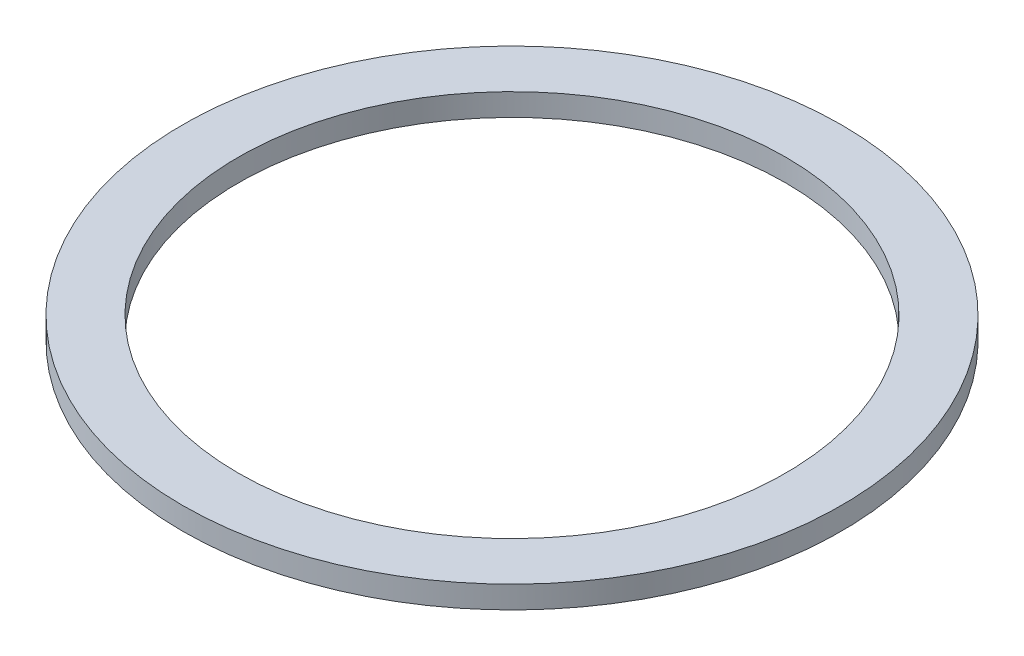
ISO-10303-21;
HEADER;
FILE_DESCRIPTION(('STEP AP214'),'2;1');
FILE_NAME('part.step','',(''),(''),'','','');
FILE_SCHEMA(('AUTOMOTIVE_DESIGN { 1 0 10303 214 1 1 1 1 }'));
ENDSEC;
DATA;
#1=APPLICATION_CONTEXT('core data for automotive mechanical design processes');
#2=APPLICATION_PROTOCOL_DEFINITION('international standard','automotive_design',2000,#1);
#3=PRODUCT_CONTEXT('',#1,'mechanical');
#4=PRODUCT('Part','Part','',(#3));
#5=PRODUCT_RELATED_PRODUCT_CATEGORY('part','',(#4));
#6=PRODUCT_DEFINITION_FORMATION('','',#4);
#7=PRODUCT_DEFINITION_CONTEXT('part definition',#1,'design');
#8=PRODUCT_DEFINITION('design','',#6,#7);
#9=PRODUCT_DEFINITION_SHAPE('','',#8);
#10=(LENGTH_UNIT() NAMED_UNIT(*) SI_UNIT(.MILLI.,.METRE.));
#11=(NAMED_UNIT(*) PLANE_ANGLE_UNIT() SI_UNIT($,.RADIAN.));
#12=(NAMED_UNIT(*) SI_UNIT($,.STERADIAN.) SOLID_ANGLE_UNIT());
#13=UNCERTAINTY_MEASURE_WITH_UNIT(LENGTH_MEASURE(1.E-05),#10,'distance_accuracy_value','');
#14=(GEOMETRIC_REPRESENTATION_CONTEXT(3) GLOBAL_UNCERTAINTY_ASSIGNED_CONTEXT((#13)) GLOBAL_UNIT_ASSIGNED_CONTEXT((#10,
#11,#12)) REPRESENTATION_CONTEXT('',''));
#15=CARTESIAN_POINT('',(0.,0.,0.));
#16=DIRECTION('',(0.,0.,1.));
#17=DIRECTION('',(1.,0.,0.));
#18=AXIS2_PLACEMENT_3D('',#15,#16,#17);
#19=CARTESIAN_POINT('',(0.,2.,0.));
#20=DIRECTION('',(0.,1.,0.));
#21=DIRECTION('',(0.,0.,1.));
#22=AXIS2_PLACEMENT_3D('',#19,#20,#21);
#23=PLANE('',#22);
#24=CARTESIAN_POINT('',(0.,2.,0.));
#25=DIRECTION('',(0.,1.,0.));
#26=DIRECTION('',(0.,0.,1.));
#27=AXIS2_PLACEMENT_3D('',#24,#25,#26);
#28=CIRCLE('',#27,29.5);
#29=CARTESIAN_POINT('',(0.,2.,29.5));
#30=VERTEX_POINT('',#29);
#31=EDGE_CURVE('E10',#30,#30,#28,.T.);
#32=ORIENTED_EDGE('',*,*,#31,.T.);
#33=EDGE_LOOP('',(#32));
#34=FACE_BOUND('',#33,.T.);
#35=CARTESIAN_POINT('',(0.,2.,0.));
#36=DIRECTION('',(0.,1.,0.));
#37=DIRECTION('',(0.,0.,1.));
#38=AXIS2_PLACEMENT_3D('',#35,#36,#37);
#39=CIRCLE('',#38,24.5);
#40=CARTESIAN_POINT('',(0.,2.,24.5));
#41=VERTEX_POINT('',#40);
#42=EDGE_CURVE('E44',#41,#41,#39,.T.);
#43=ORIENTED_EDGE('',*,*,#42,.F.);
#44=EDGE_LOOP('',(#43));
#45=FACE_BOUND('',#44,.T.);
#46=ADVANCED_FACE('F33',(#34,#45),#23,.T.);
#47=CARTESIAN_POINT('',(0.,0.,0.));
#48=DIRECTION('',(0.,1.,0.));
#49=DIRECTION('',(0.,0.,1.));
#50=AXIS2_PLACEMENT_3D('',#47,#48,#49);
#51=PLANE('',#50);
#52=CARTESIAN_POINT('',(0.,0.,0.));
#53=DIRECTION('',(0.,1.,0.));
#54=DIRECTION('',(0.,0.,1.));
#55=AXIS2_PLACEMENT_3D('',#52,#53,#54);
#56=CIRCLE('',#55,29.5);
#57=CARTESIAN_POINT('',(0.,0.,29.5));
#58=VERTEX_POINT('',#57);
#59=EDGE_CURVE('E37',#58,#58,#56,.T.);
#60=ORIENTED_EDGE('',*,*,#59,.F.);
#61=EDGE_LOOP('',(#60));
#62=FACE_BOUND('',#61,.T.);
#63=CARTESIAN_POINT('',(0.,0.,0.));
#64=DIRECTION('',(0.,1.,0.));
#65=DIRECTION('',(0.,0.,1.));
#66=AXIS2_PLACEMENT_3D('',#63,#64,#65);
#67=CIRCLE('',#66,24.5);
#68=CARTESIAN_POINT('',(0.,0.,24.5));
#69=VERTEX_POINT('',#68);
#70=EDGE_CURVE('E46',#69,#69,#67,.T.);
#71=ORIENTED_EDGE('',*,*,#70,.T.);
#72=EDGE_LOOP('',(#71));
#73=FACE_BOUND('',#72,.T.);
#74=ADVANCED_FACE('F56',(#62,#73),#51,.F.);
#75=CARTESIAN_POINT('',(0.,2.,0.));
#76=DIRECTION('',(0.,-1.,0.));
#77=DIRECTION('',(0.,0.,-1.));
#78=AXIS2_PLACEMENT_3D('',#75,#76,#77);
#79=CYLINDRICAL_SURFACE('',#78,29.5);
#80=ORIENTED_EDGE('',*,*,#31,.F.);
#81=EDGE_LOOP('',(#80));
#82=FACE_BOUND('',#81,.T.);
#83=ORIENTED_EDGE('',*,*,#59,.T.);
#84=EDGE_LOOP('',(#83));
#85=FACE_BOUND('',#84,.T.);
#86=ADVANCED_FACE('F35',(#82,#85),#79,.T.);
#87=CARTESIAN_POINT('',(0.,2.,0.));
#88=DIRECTION('',(0.,-1.,0.));
#89=DIRECTION('',(0.,0.,-1.));
#90=AXIS2_PLACEMENT_3D('',#87,#88,#89);
#91=CYLINDRICAL_SURFACE('',#90,24.5);
#92=ORIENTED_EDGE('',*,*,#42,.T.);
#93=EDGE_LOOP('',(#92));
#94=FACE_BOUND('',#93,.T.);
#95=ORIENTED_EDGE('',*,*,#70,.F.);
#96=EDGE_LOOP('',(#95));
#97=FACE_BOUND('',#96,.T.);
#98=ADVANCED_FACE('F52',(#94,#97),#91,.F.);
#99=CLOSED_SHELL('',(#46,#74,#86,#98));
#100=MANIFOLD_SOLID_BREP('B2',#99);
#101=ADVANCED_BREP_SHAPE_REPRESENTATION('',(#18,#100),#14);
#102=SHAPE_DEFINITION_REPRESENTATION(#9,#101);
ENDSEC;
END-ISO-10303-21;
